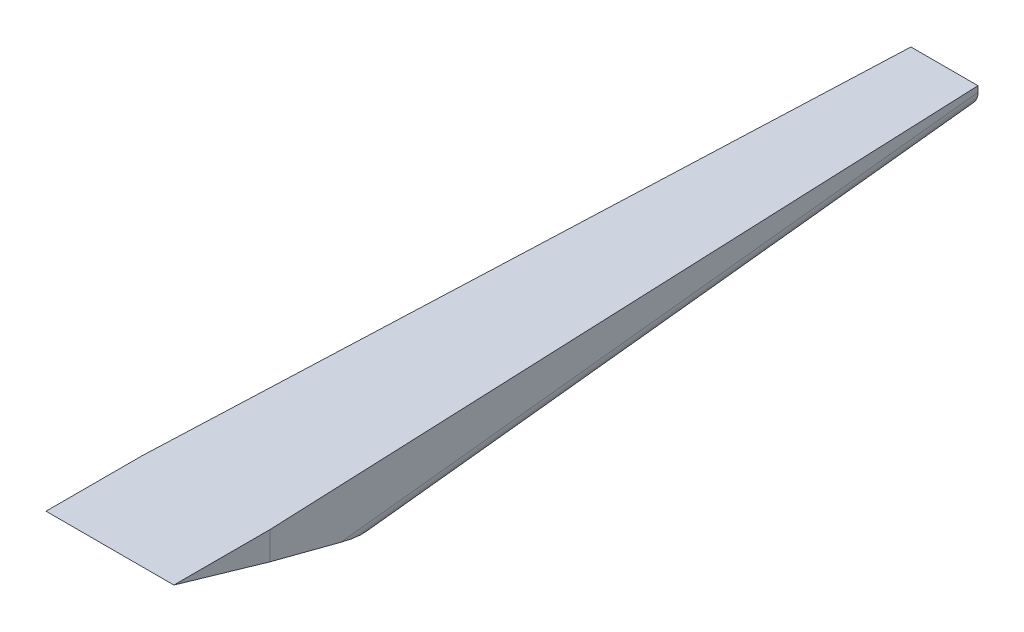
ISO-10303-21;
HEADER;
FILE_DESCRIPTION(('STEP AP214'),'2;1');
FILE_NAME('part.step','',(''),(''),'','','');
FILE_SCHEMA(('AUTOMOTIVE_DESIGN { 1 0 10303 214 1 1 1 1 }'));
ENDSEC;
DATA;
#1=APPLICATION_CONTEXT('core data for automotive mechanical design processes');
#2=APPLICATION_PROTOCOL_DEFINITION('international standard','automotive_design',2000,#1);
#3=PRODUCT_CONTEXT('',#1,'mechanical');
#4=PRODUCT('Part','Part','',(#3));
#5=PRODUCT_RELATED_PRODUCT_CATEGORY('part','',(#4));
#6=PRODUCT_DEFINITION_FORMATION('','',#4);
#7=PRODUCT_DEFINITION_CONTEXT('part definition',#1,'design');
#8=PRODUCT_DEFINITION('design','',#6,#7);
#9=PRODUCT_DEFINITION_SHAPE('','',#8);
#10=(LENGTH_UNIT() NAMED_UNIT(*) SI_UNIT(.MILLI.,.METRE.));
#11=(NAMED_UNIT(*) PLANE_ANGLE_UNIT() SI_UNIT($,.RADIAN.));
#12=(NAMED_UNIT(*) SI_UNIT($,.STERADIAN.) SOLID_ANGLE_UNIT());
#13=UNCERTAINTY_MEASURE_WITH_UNIT(LENGTH_MEASURE(1.E-05),#10,'distance_accuracy_value','');
#14=(GEOMETRIC_REPRESENTATION_CONTEXT(3) GLOBAL_UNCERTAINTY_ASSIGNED_CONTEXT((#13)) GLOBAL_UNIT_ASSIGNED_CONTEXT((#10,
#11,#12)) REPRESENTATION_CONTEXT('',''));
#15=CARTESIAN_POINT('',(0.,0.,0.));
#16=DIRECTION('',(0.,0.,1.));
#17=DIRECTION('',(1.,0.,0.));
#18=AXIS2_PLACEMENT_3D('',#15,#16,#17);
#19=CARTESIAN_POINT('',(0.,5.08000000000002,0.));
#20=DIRECTION('',(0.,1.,0.));
#21=DIRECTION('',(0.,0.,1.));
#22=AXIS2_PLACEMENT_3D('',#19,#20,#21);
#23=PLANE('',#22);
#24=DIRECTION('',(-1.,0.,0.));
#25=VECTOR('',#24,1.);
#26=CARTESIAN_POINT('',(0.,5.08000000000002,-967.761500261916));
#27=LINE('',#26,#25);
#28=CARTESIAN_POINT('',(26.6456892184653,5.08000000000002,-967.761500261916));
#29=VERTEX_POINT('',#28);
#30=CARTESIAN_POINT('',(-26.6456892184653,5.08000000000002,-967.761500261916));
#31=VERTEX_POINT('',#30);
#32=EDGE_CURVE('E134',#29,#31,#27,.T.);
#33=ORIENTED_EDGE('',*,*,#32,.T.);
#34=DIRECTION('',(-0.0411377422918956,0.,0.999153484785559));
#35=VECTOR('',#34,1.);
#36=CARTESIAN_POINT('',(-66.3784184874971,5.08000000000002,-2.732971775671));
#37=LINE('',#36,#35);
#38=CARTESIAN_POINT('',(-50.8,5.08000000000002,-381.1016));
#39=VERTEX_POINT('',#38);
#40=EDGE_CURVE('E124',#31,#39,#37,.T.);
#41=ORIENTED_EDGE('',*,*,#40,.T.);
#42=DIRECTION('',(0.,0.,-1.));
#43=VECTOR('',#42,1.);
#44=CARTESIAN_POINT('',(-50.8,5.08000000000002,-381.1016));
#45=LINE('',#44,#43);
#46=CARTESIAN_POINT('',(-50.8,5.08000000000002,-304.8));
#47=VERTEX_POINT('',#46);
#48=EDGE_CURVE('E111',#47,#39,#45,.T.);
#49=ORIENTED_EDGE('',*,*,#48,.F.);
#50=DIRECTION('',(1.,0.,0.));
#51=VECTOR('',#50,1.);
#52=CARTESIAN_POINT('',(-50.8100231326969,5.08000000000002,-304.8));
#53=LINE('',#52,#51);
#54=CARTESIAN_POINT('',(50.8,5.08000000000002,-304.8));
#55=VERTEX_POINT('',#54);
#56=EDGE_CURVE('E122',#47,#55,#53,.T.);
#57=ORIENTED_EDGE('',*,*,#56,.T.);
#58=DIRECTION('',(0.,0.,1.));
#59=VECTOR('',#58,1.);
#60=CARTESIAN_POINT('',(50.8,5.08000000000002,-381.1016));
#61=LINE('',#60,#59);
#62=CARTESIAN_POINT('',(50.8,5.08000000000002,-381.1016));
#63=VERTEX_POINT('',#62);
#64=EDGE_CURVE('E126',#63,#55,#61,.T.);
#65=ORIENTED_EDGE('',*,*,#64,.F.);
#66=DIRECTION('',(-0.0411377422918955,0.,-0.999153484785559));
#67=VECTOR('',#66,1.);
#68=CARTESIAN_POINT('',(66.3784184874971,5.08000000000002,-2.73297177567099));
#69=LINE('',#68,#67);
#70=EDGE_CURVE('E130',#63,#29,#69,.T.);
#71=ORIENTED_EDGE('',*,*,#70,.T.);
#72=EDGE_LOOP('',(#33,#41,#49,#57,#65,#71));
#73=FACE_BOUND('',#72,.T.);
#74=ADVANCED_FACE('F45',(#73),#23,.T.);
#75=CARTESIAN_POINT('',(0.,0.,-967.761500261916));
#76=DIRECTION('',(0.,0.,1.));
#77=DIRECTION('',(1.,0.,0.));
#78=AXIS2_PLACEMENT_3D('',#75,#76,#77);
#79=PLANE('',#78);
#80=ORIENTED_EDGE('',*,*,#32,.F.);
#81=DIRECTION('',(0.,1.,0.));
#82=VECTOR('',#81,1.);
#83=CARTESIAN_POINT('',(26.6456892184653,0.,-967.761500261916));
#84=LINE('',#83,#82);
#85=CARTESIAN_POINT('',(26.6456892184653,0.540007355199504,-967.761500261916));
#86=VERTEX_POINT('',#85);
#87=EDGE_CURVE('E145',#86,#29,#84,.T.);
#88=ORIENTED_EDGE('',*,*,#87,.F.);
#89=CARTESIAN_POINT('',(13.9349293668638,0.574424306919341,-967.761500261916));
#90=DIRECTION('',(0.,0.,1.));
#91=DIRECTION('',(0.52999894000318,-0.847998304005088,0.));
#92=AXIS2_PLACEMENT_3D('',#89,#90,#91);
#93=ELLIPSE('',#92,12.738263656327,12.7);
#94=CARTESIAN_POINT('',(13.9693009777976,-12.1531027495444,-967.761500261916));
#95=VERTEX_POINT('',#94);
#96=EDGE_CURVE('E135',#86,#95,#93,.F.);
#97=ORIENTED_EDGE('',*,*,#96,.T.);
#98=DIRECTION('',(1.,0.,0.));
#99=VECTOR('',#98,1.);
#100=CARTESIAN_POINT('',(0.,-12.1531027495444,-967.761500261916));
#101=LINE('',#100,#99);
#102=CARTESIAN_POINT('',(-13.9693009777976,-12.1531027495444,-967.761500261916));
#103=VERTEX_POINT('',#102);
#104=EDGE_CURVE('E144',#103,#95,#101,.T.);
#105=ORIENTED_EDGE('',*,*,#104,.F.);
#106=CARTESIAN_POINT('',(-13.9349293668638,0.574424306919327,-967.761500261916));
#107=DIRECTION('',(0.,0.,1.));
#108=DIRECTION('',(-0.52999894000318,-0.847998304005088,0.));
#109=AXIS2_PLACEMENT_3D('',#106,#107,#108);
#110=ELLIPSE('',#109,12.738263656327,12.7);
#111=CARTESIAN_POINT('',(-26.6456892184653,0.540007355199476,-967.761500261916));
#112=VERTEX_POINT('',#111);
#113=EDGE_CURVE('E125',#103,#112,#110,.F.);
#114=ORIENTED_EDGE('',*,*,#113,.T.);
#115=DIRECTION('',(0.,-1.,0.));
#116=VECTOR('',#115,1.);
#117=CARTESIAN_POINT('',(-26.6456892184653,0.,-967.761500261916));
#118=LINE('',#117,#116);
#119=EDGE_CURVE('E141',#31,#112,#118,.T.);
#120=ORIENTED_EDGE('',*,*,#119,.F.);
#121=EDGE_LOOP('',(#80,#88,#97,#105,#114,#120));
#122=FACE_BOUND('',#121,.T.);
#123=ADVANCED_FACE('F196',(#122),#79,.F.);
#124=CARTESIAN_POINT('',(50.8,-50.8,-381.1016));
#125=DIRECTION('',(1.,0.,0.));
#126=DIRECTION('',(0.,0.,-1.));
#127=AXIS2_PLACEMENT_3D('',#124,#125,#126);
#128=PLANE('',#127);
#129=DIRECTION('',(0.,1.,0.));
#130=VECTOR('',#129,1.);
#131=CARTESIAN_POINT('',(50.8,-50.8,-381.1016));
#132=LINE('',#131,#130);
#133=CARTESIAN_POINT('',(50.8,-17.1324679358292,-381.1016));
#134=VERTEX_POINT('',#133);
#135=EDGE_CURVE('E54',#134,#63,#132,.T.);
#136=ORIENTED_EDGE('',*,*,#135,.T.);
#137=ORIENTED_EDGE('',*,*,#64,.T.);
#138=DIRECTION('',(0.,0.279510972848873,0.960142497787217));
#139=VECTOR('',#138,1.);
#140=CARTESIAN_POINT('',(50.8,-19.7627904722853,-390.136967822588));
#141=LINE('',#140,#139);
#142=EDGE_CURVE('E68',#134,#55,#141,.T.);
#143=ORIENTED_EDGE('',*,*,#142,.F.);
#144=EDGE_LOOP('',(#136,#137,#143));
#145=FACE_BOUND('',#144,.T.);
#146=ADVANCED_FACE('F204',(#145),#128,.T.);
#147=CARTESIAN_POINT('',(-50.8,-50.8,-381.1016));
#148=DIRECTION('',(-1.,0.,0.));
#149=DIRECTION('',(0.,0.,1.));
#150=AXIS2_PLACEMENT_3D('',#147,#148,#149);
#151=PLANE('',#150);
#152=DIRECTION('',(0.,-0.279510972848873,-0.960142497787217));
#153=VECTOR('',#152,1.);
#154=CARTESIAN_POINT('',(-50.8,-19.7627904722853,-390.136967822588));
#155=LINE('',#154,#153);
#156=CARTESIAN_POINT('',(-50.8,-17.1324679358292,-381.1016));
#157=VERTEX_POINT('',#156);
#158=EDGE_CURVE('E108',#47,#157,#155,.T.);
#159=ORIENTED_EDGE('',*,*,#158,.F.);
#160=ORIENTED_EDGE('',*,*,#48,.T.);
#161=DIRECTION('',(0.,1.,0.));
#162=VECTOR('',#161,1.);
#163=CARTESIAN_POINT('',(-50.8,-50.8,-381.1016));
#164=LINE('',#163,#162);
#165=EDGE_CURVE('E11',#39,#157,#164,.F.);
#166=ORIENTED_EDGE('',*,*,#165,.T.);
#167=EDGE_LOOP('',(#159,#160,#166));
#168=FACE_BOUND('',#167,.T.);
#169=ADVANCED_FACE('F110',(#168),#151,.T.);
#170=CARTESIAN_POINT('',(66.3784184874971,0.,-2.73297177567099));
#171=DIRECTION('',(-0.999153484785559,0.,0.0411377422918955));
#172=DIRECTION('',(0.0411377422918955,0.,0.999153484785559));
#173=AXIS2_PLACEMENT_3D('',#170,#171,#172);
#174=PLANE('',#173);
#175=ORIENTED_EDGE('',*,*,#70,.F.);
#176=ORIENTED_EDGE('',*,*,#135,.F.);
#177=DIRECTION('',(-0.0395007060040847,-0.279292826429343,-0.959393147427209));
#178=VECTOR('',#177,1.);
#179=CARTESIAN_POINT('',(65.3522419153154,85.7602949173641,-27.65674836082));
#180=LINE('',#179,#178);
#181=CARTESIAN_POINT('',(48.3809661431277,-34.2364357242603,-439.855094315715));
#182=VERTEX_POINT('',#181);
#183=EDGE_CURVE('E116',#134,#182,#180,.T.);
#184=ORIENTED_EDGE('',*,*,#183,.T.);
#185=DIRECTION('',(0.041048919791328,-0.0656782716661249,0.996996163891775));
#186=VECTOR('',#185,1.);
#187=CARTESIAN_POINT('',(66.2084818529801,-62.7604608600243,-6.86039275481798));
#188=LINE('',#187,#186);
#189=EDGE_CURVE('E164',#182,#86,#188,.F.);
#190=ORIENTED_EDGE('',*,*,#189,.T.);
#191=ORIENTED_EDGE('',*,*,#87,.T.);
#192=EDGE_LOOP('',(#175,#176,#184,#190,#191));
#193=FACE_BOUND('',#192,.T.);
#194=ADVANCED_FACE('F47',(#193),#174,.F.);
#195=CARTESIAN_POINT('',(-66.3784184874971,0.,-2.732971775671));
#196=DIRECTION('',(0.999153484785559,0.,0.0411377422918956));
#197=DIRECTION('',(0.0411377422918956,0.,-0.999153484785559));
#198=AXIS2_PLACEMENT_3D('',#195,#196,#197);
#199=PLANE('',#198);
#200=ORIENTED_EDGE('',*,*,#40,.F.);
#201=ORIENTED_EDGE('',*,*,#119,.T.);
#202=DIRECTION('',(-0.0410489197913281,-0.0656782716661249,0.996996163891775));
#203=VECTOR('',#202,1.);
#204=CARTESIAN_POINT('',(-66.2084818529802,-62.7604608600244,-6.86039275481799));
#205=LINE('',#204,#203);
#206=CARTESIAN_POINT('',(-48.3809661431277,-34.2364357242604,-439.855094315715));
#207=VERTEX_POINT('',#206);
#208=EDGE_CURVE('E167',#112,#207,#205,.T.);
#209=ORIENTED_EDGE('',*,*,#208,.T.);
#210=DIRECTION('',(-0.0395007060040847,0.279292826429344,0.95939314742721));
#211=VECTOR('',#210,1.);
#212=CARTESIAN_POINT('',(-65.3522419153154,85.7602949173641,-27.65674836082));
#213=LINE('',#212,#211);
#214=EDGE_CURVE('E178',#207,#157,#213,.T.);
#215=ORIENTED_EDGE('',*,*,#214,.T.);
#216=ORIENTED_EDGE('',*,*,#165,.F.);
#217=EDGE_LOOP('',(#200,#201,#209,#215,#216));
#218=FACE_BOUND('',#217,.T.);
#219=ADVANCED_FACE('F205',(#218),#199,.F.);
#220=CARTESIAN_POINT('',(-50.8100231326969,5.08000000000002,-304.8));
#221=DIRECTION('',(0.,0.960142497787217,-0.279510972848873));
#222=DIRECTION('',(0.,0.279510972848873,0.960142497787217));
#223=AXIS2_PLACEMENT_3D('',#220,#221,#222);
#224=PLANE('',#223);
#225=ORIENTED_EDGE('',*,*,#158,.T.);
#226=ORIENTED_EDGE('',*,*,#214,.F.);
#227=CARTESIAN_POINT('',(-35.674175686803,-34.2083698049835,-439.758685643231));
#228=DIRECTION('',(0.,0.960142497787217,-0.279510972848873));
#229=DIRECTION('',(-0.0436784733201309,0.279244218779965,0.959226176272515));
#230=AXIS2_PLACEMENT_3D('',#227,#228,#229);
#231=ELLIPSE('',#230,37.1636397060836,12.7);
#232=CARTESIAN_POINT('',(-34.2406489726531,-44.5872595413131,-475.411000162867));
#233=VERTEX_POINT('',#232);
#234=EDGE_CURVE('E163',#207,#233,#231,.F.);
#235=ORIENTED_EDGE('',*,*,#234,.T.);
#236=DIRECTION('',(-1.,0.,0.));
#237=VECTOR('',#236,1.);
#238=CARTESIAN_POINT('',(1.86869260817995E-13,-44.5872595413131,-475.411000162867));
#239=LINE('',#238,#237);
#240=CARTESIAN_POINT('',(34.240648972653,-44.5872595413131,-475.411000162867));
#241=VERTEX_POINT('',#240);
#242=EDGE_CURVE('E159',#241,#233,#239,.T.);
#243=ORIENTED_EDGE('',*,*,#242,.F.);
#244=CARTESIAN_POINT('',(35.674175686803,-34.2083698049835,-439.758685643231));
#245=DIRECTION('',(0.,0.960142497787217,-0.279510972848873));
#246=DIRECTION('',(0.0436784733201309,0.279244218779965,0.959226176272515));
#247=AXIS2_PLACEMENT_3D('',#244,#245,#246);
#248=ELLIPSE('',#247,37.1636397060836,12.7);
#249=EDGE_CURVE('E143',#241,#182,#248,.F.);
#250=ORIENTED_EDGE('',*,*,#249,.T.);
#251=ORIENTED_EDGE('',*,*,#183,.F.);
#252=ORIENTED_EDGE('',*,*,#142,.T.);
#253=ORIENTED_EDGE('',*,*,#56,.F.);
#254=EDGE_LOOP('',(#225,#226,#235,#243,#250,#251,#252,#253));
#255=FACE_BOUND('',#254,.T.);
#256=ADVANCED_FACE('F128',(#255),#224,.F.);
#257=CARTESIAN_POINT('',(0.,-75.5775259125343,-4.97875664772953));
#258=DIRECTION('',(0.,0.997837203068467,0.0657336760914669));
#259=DIRECTION('',(0.,-0.0657336760914669,0.997837203068468));
#260=AXIS2_PLACEMENT_3D('',#257,#258,#259);
#261=PLANE('',#260);
#262=DIRECTION('',(-0.0410489197913281,-0.0656782716661249,0.996996163891775));
#263=VECTOR('',#262,1.);
#264=CARTESIAN_POINT('',(-53.5192325962036,-75.4329933389939,-7.17276111407254));
#265=LINE('',#264,#263);
#266=EDGE_CURVE('E140',#233,#103,#265,.F.);
#267=ORIENTED_EDGE('',*,*,#266,.T.);
#268=ORIENTED_EDGE('',*,*,#104,.T.);
#269=DIRECTION('',(0.041048919791328,-0.0656782716661249,0.996996163891775));
#270=VECTOR('',#269,1.);
#271=CARTESIAN_POINT('',(53.5192325962035,-75.4329933389939,-7.17276111407254));
#272=LINE('',#271,#270);
#273=EDGE_CURVE('E158',#95,#241,#272,.T.);
#274=ORIENTED_EDGE('',*,*,#273,.T.);
#275=ORIENTED_EDGE('',*,*,#242,.T.);
#276=EDGE_LOOP('',(#267,#268,#274,#275));
#277=FACE_BOUND('',#276,.T.);
#278=ADVANCED_FACE('F183',(#277),#261,.F.);
#279=CARTESIAN_POINT('',(53.5192325962035,-62.7604608600243,-6.33794342771091));
#280=DIRECTION('',(0.041048919791328,-0.0656782716661249,0.996996163891775));
#281=DIRECTION('',(0.,-0.997837203068468,-0.0657336760914669));
#282=AXIS2_PLACEMENT_3D('',#279,#280,#281);
#283=CYLINDRICAL_SURFACE('',#282,12.7);
#284=ORIENTED_EDGE('',*,*,#96,.F.);
#285=ORIENTED_EDGE('',*,*,#189,.F.);
#286=ORIENTED_EDGE('',*,*,#249,.F.);
#287=ORIENTED_EDGE('',*,*,#273,.F.);
#288=EDGE_LOOP('',(#284,#285,#286,#287));
#289=FACE_BOUND('',#288,.T.);
#290=ADVANCED_FACE('F200',(#289),#283,.T.);
#291=CARTESIAN_POINT('',(-53.5192325962036,-62.7604608600244,-6.33794342771091));
#292=DIRECTION('',(-0.0410489197913281,-0.0656782716661249,0.996996163891775));
#293=DIRECTION('',(0.,-0.997837203068467,-0.0657336760914669));
#294=AXIS2_PLACEMENT_3D('',#291,#292,#293);
#295=CYLINDRICAL_SURFACE('',#294,12.7);
#296=ORIENTED_EDGE('',*,*,#113,.F.);
#297=ORIENTED_EDGE('',*,*,#266,.F.);
#298=ORIENTED_EDGE('',*,*,#234,.F.);
#299=ORIENTED_EDGE('',*,*,#208,.F.);
#300=EDGE_LOOP('',(#296,#297,#298,#299));
#301=FACE_BOUND('',#300,.T.);
#302=ADVANCED_FACE('F190',(#301),#295,.T.);
#303=CLOSED_SHELL('',(#74,#123,#146,#169,#194,#219,#256,#278,#290,#302));
#304=MANIFOLD_SOLID_BREP('B2',#303);
#305=ADVANCED_BREP_SHAPE_REPRESENTATION('',(#18,#304),#14);
#306=SHAPE_DEFINITION_REPRESENTATION(#9,#305);
ENDSEC;
END-ISO-10303-21;
